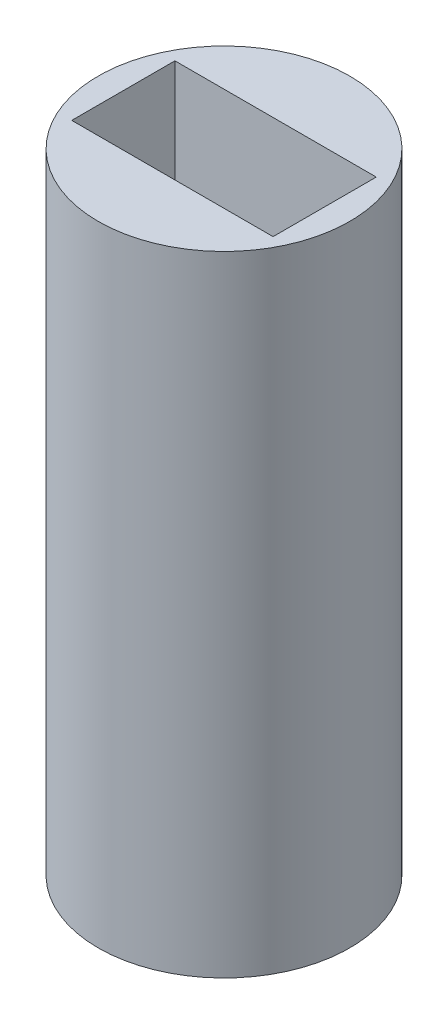
ISO-10303-21;
HEADER;
FILE_DESCRIPTION(('STEP AP214'),'2;1');
FILE_NAME('part.step','',(''),(''),'','','');
FILE_SCHEMA(('AUTOMOTIVE_DESIGN { 1 0 10303 214 1 1 1 1 }'));
ENDSEC;
DATA;
#1=APPLICATION_CONTEXT('core data for automotive mechanical design processes');
#2=APPLICATION_PROTOCOL_DEFINITION('international standard','automotive_design',2000,#1);
#3=PRODUCT_CONTEXT('',#1,'mechanical');
#4=PRODUCT('Part','Part','',(#3));
#5=PRODUCT_RELATED_PRODUCT_CATEGORY('part','',(#4));
#6=PRODUCT_DEFINITION_FORMATION('','',#4);
#7=PRODUCT_DEFINITION_CONTEXT('part definition',#1,'design');
#8=PRODUCT_DEFINITION('design','',#6,#7);
#9=PRODUCT_DEFINITION_SHAPE('','',#8);
#10=(LENGTH_UNIT() NAMED_UNIT(*) SI_UNIT(.MILLI.,.METRE.));
#11=(NAMED_UNIT(*) PLANE_ANGLE_UNIT() SI_UNIT($,.RADIAN.));
#12=(NAMED_UNIT(*) SI_UNIT($,.STERADIAN.) SOLID_ANGLE_UNIT());
#13=UNCERTAINTY_MEASURE_WITH_UNIT(LENGTH_MEASURE(1.E-05),#10,'distance_accuracy_value','');
#14=(GEOMETRIC_REPRESENTATION_CONTEXT(3) GLOBAL_UNCERTAINTY_ASSIGNED_CONTEXT((#13)) GLOBAL_UNIT_ASSIGNED_CONTEXT((#10,
#11,#12)) REPRESENTATION_CONTEXT('',''));
#15=CARTESIAN_POINT('',(0.,0.,0.));
#16=DIRECTION('',(0.,0.,1.));
#17=DIRECTION('',(1.,0.,0.));
#18=AXIS2_PLACEMENT_3D('',#15,#16,#17);
#19=CARTESIAN_POINT('',(0.,25.,0.));
#20=DIRECTION('',(0.,1.,0.));
#21=DIRECTION('',(0.,0.,1.));
#22=AXIS2_PLACEMENT_3D('',#19,#20,#21);
#23=PLANE('',#22);
#24=CARTESIAN_POINT('',(0.,25.,0.));
#25=DIRECTION('',(0.,1.,0.));
#26=DIRECTION('',(0.,0.,1.));
#27=AXIS2_PLACEMENT_3D('',#24,#25,#26);
#28=CIRCLE('',#27,5.);
#29=CARTESIAN_POINT('',(0.,25.,5.));
#30=VERTEX_POINT('',#29);
#31=EDGE_CURVE('E11',#30,#30,#28,.T.);
#32=ORIENTED_EDGE('',*,*,#31,.T.);
#33=EDGE_LOOP('',(#32));
#34=FACE_BOUND('',#33,.T.);
#35=DIRECTION('',(0.,0.,1.));
#36=VECTOR('',#35,1.);
#37=CARTESIAN_POINT('',(-4.,25.,-2.05));
#38=LINE('',#37,#36);
#39=CARTESIAN_POINT('',(-4.,25.,-2.05));
#40=VERTEX_POINT('',#39);
#41=CARTESIAN_POINT('',(-4.,25.,2.05));
#42=VERTEX_POINT('',#41);
#43=EDGE_CURVE('E89',#40,#42,#38,.T.);
#44=ORIENTED_EDGE('',*,*,#43,.F.);
#45=DIRECTION('',(-1.,0.,0.));
#46=VECTOR('',#45,1.);
#47=CARTESIAN_POINT('',(-4.,25.,-2.05));
#48=LINE('',#47,#46);
#49=CARTESIAN_POINT('',(4.,25.,-2.05));
#50=VERTEX_POINT('',#49);
#51=EDGE_CURVE('E94',#50,#40,#48,.T.);
#52=ORIENTED_EDGE('',*,*,#51,.F.);
#53=DIRECTION('',(0.,0.,1.));
#54=VECTOR('',#53,1.);
#55=CARTESIAN_POINT('',(4.,25.,-2.05));
#56=LINE('',#55,#54);
#57=CARTESIAN_POINT('',(4.,25.,2.05));
#58=VERTEX_POINT('',#57);
#59=EDGE_CURVE('E79',#50,#58,#56,.T.);
#60=ORIENTED_EDGE('',*,*,#59,.T.);
#61=DIRECTION('',(-1.,0.,0.));
#62=VECTOR('',#61,1.);
#63=CARTESIAN_POINT('',(-4.,25.,2.05));
#64=LINE('',#63,#62);
#65=EDGE_CURVE('E106',#58,#42,#64,.T.);
#66=ORIENTED_EDGE('',*,*,#65,.T.);
#67=EDGE_LOOP('',(#44,#52,#60,#66));
#68=FACE_BOUND('',#67,.T.);
#69=ADVANCED_FACE('F33',(#34,#68),#23,.T.);
#70=CARTESIAN_POINT('',(0.,25.,0.));
#71=DIRECTION('',(0.,-1.,0.));
#72=DIRECTION('',(0.,0.,-1.));
#73=AXIS2_PLACEMENT_3D('',#70,#71,#72);
#74=CYLINDRICAL_SURFACE('',#73,5.);
#75=ORIENTED_EDGE('',*,*,#31,.F.);
#76=EDGE_LOOP('',(#75));
#77=FACE_BOUND('',#76,.T.);
#78=CARTESIAN_POINT('',(0.,0.,0.));
#79=DIRECTION('',(0.,1.,0.));
#80=DIRECTION('',(0.,0.,1.));
#81=AXIS2_PLACEMENT_3D('',#78,#79,#80);
#82=CIRCLE('',#81,5.);
#83=CARTESIAN_POINT('',(0.,0.,5.));
#84=VERTEX_POINT('',#83);
#85=EDGE_CURVE('E37',#84,#84,#82,.T.);
#86=ORIENTED_EDGE('',*,*,#85,.T.);
#87=EDGE_LOOP('',(#86));
#88=FACE_BOUND('',#87,.T.);
#89=ADVANCED_FACE('F35',(#77,#88),#74,.T.);
#90=CARTESIAN_POINT('',(0.,0.,0.));
#91=DIRECTION('',(0.,1.,0.));
#92=DIRECTION('',(0.,0.,1.));
#93=AXIS2_PLACEMENT_3D('',#90,#91,#92);
#94=PLANE('',#93);
#95=ORIENTED_EDGE('',*,*,#85,.F.);
#96=EDGE_LOOP('',(#95));
#97=FACE_BOUND('',#96,.T.);
#98=ADVANCED_FACE('F115',(#97),#94,.F.);
#99=CARTESIAN_POINT('',(0.,11.5,-2.05));
#100=DIRECTION('',(0.,0.,1.));
#101=DIRECTION('',(1.,0.,0.));
#102=AXIS2_PLACEMENT_3D('',#99,#100,#101);
#103=CYLINDRICAL_SURFACE('',#102,4.);
#104=CARTESIAN_POINT('',(0.,11.5,2.05));
#105=DIRECTION('',(0.,0.,1.));
#106=DIRECTION('',(1.,0.,0.));
#107=AXIS2_PLACEMENT_3D('',#104,#105,#106);
#108=CIRCLE('',#107,4.);
#109=CARTESIAN_POINT('',(-4.,11.5,2.05));
#110=VERTEX_POINT('',#109);
#111=CARTESIAN_POINT('',(4.,11.5,2.05));
#112=VERTEX_POINT('',#111);
#113=EDGE_CURVE('E103',#110,#112,#108,.T.);
#114=ORIENTED_EDGE('',*,*,#113,.T.);
#115=DIRECTION('',(0.,0.,1.));
#116=VECTOR('',#115,1.);
#117=CARTESIAN_POINT('',(4.,11.5,-2.05));
#118=LINE('',#117,#116);
#119=CARTESIAN_POINT('',(4.,11.5,-2.05));
#120=VERTEX_POINT('',#119);
#121=EDGE_CURVE('E73',#120,#112,#118,.T.);
#122=ORIENTED_EDGE('',*,*,#121,.F.);
#123=CARTESIAN_POINT('',(0.,11.5,-2.05));
#124=DIRECTION('',(0.,0.,1.));
#125=DIRECTION('',(1.,0.,0.));
#126=AXIS2_PLACEMENT_3D('',#123,#124,#125);
#127=CIRCLE('',#126,4.);
#128=CARTESIAN_POINT('',(-4.,11.5,-2.05));
#129=VERTEX_POINT('',#128);
#130=EDGE_CURVE('E95',#129,#120,#127,.T.);
#131=ORIENTED_EDGE('',*,*,#130,.F.);
#132=DIRECTION('',(0.,0.,1.));
#133=VECTOR('',#132,1.);
#134=CARTESIAN_POINT('',(-4.,11.5,-2.05));
#135=LINE('',#134,#133);
#136=EDGE_CURVE('E56',#129,#110,#135,.T.);
#137=ORIENTED_EDGE('',*,*,#136,.T.);
#138=EDGE_LOOP('',(#114,#122,#131,#137));
#139=FACE_BOUND('',#138,.T.);
#140=ADVANCED_FACE('F112',(#139),#103,.F.);
#141=CARTESIAN_POINT('',(-4.,11.5,-2.05));
#142=DIRECTION('',(-1.,0.,0.));
#143=DIRECTION('',(0.,0.,1.));
#144=AXIS2_PLACEMENT_3D('',#141,#142,#143);
#145=PLANE('',#144);
#146=DIRECTION('',(0.,-1.,0.));
#147=VECTOR('',#146,1.);
#148=CARTESIAN_POINT('',(-4.,11.5,2.05));
#149=LINE('',#148,#147);
#150=EDGE_CURVE('E48',#42,#110,#149,.T.);
#151=ORIENTED_EDGE('',*,*,#150,.T.);
#152=ORIENTED_EDGE('',*,*,#136,.F.);
#153=DIRECTION('',(0.,-1.,0.));
#154=VECTOR('',#153,1.);
#155=CARTESIAN_POINT('',(-4.,11.5,-2.05));
#156=LINE('',#155,#154);
#157=EDGE_CURVE('E98',#40,#129,#156,.T.);
#158=ORIENTED_EDGE('',*,*,#157,.F.);
#159=ORIENTED_EDGE('',*,*,#43,.T.);
#160=EDGE_LOOP('',(#151,#152,#158,#159));
#161=FACE_BOUND('',#160,.T.);
#162=ADVANCED_FACE('F114',(#161),#145,.F.);
#163=CARTESIAN_POINT('',(4.,11.5,-2.05));
#164=DIRECTION('',(1.,0.,0.));
#165=DIRECTION('',(0.,0.,-1.));
#166=AXIS2_PLACEMENT_3D('',#163,#164,#165);
#167=PLANE('',#166);
#168=DIRECTION('',(0.,1.,0.));
#169=VECTOR('',#168,1.);
#170=CARTESIAN_POINT('',(4.,11.5,2.05));
#171=LINE('',#170,#169);
#172=EDGE_CURVE('E85',#112,#58,#171,.T.);
#173=ORIENTED_EDGE('',*,*,#172,.T.);
#174=ORIENTED_EDGE('',*,*,#59,.F.);
#175=DIRECTION('',(0.,1.,0.));
#176=VECTOR('',#175,1.);
#177=CARTESIAN_POINT('',(4.,11.5,-2.05));
#178=LINE('',#177,#176);
#179=EDGE_CURVE('E82',#120,#50,#178,.T.);
#180=ORIENTED_EDGE('',*,*,#179,.F.);
#181=ORIENTED_EDGE('',*,*,#121,.T.);
#182=EDGE_LOOP('',(#173,#174,#180,#181));
#183=FACE_BOUND('',#182,.T.);
#184=ADVANCED_FACE('F81',(#183),#167,.F.);
#185=CARTESIAN_POINT('',(0.,11.5,-2.05));
#186=DIRECTION('',(0.,0.,1.));
#187=DIRECTION('',(1.,0.,0.));
#188=AXIS2_PLACEMENT_3D('',#185,#186,#187);
#189=PLANE('',#188);
#190=ORIENTED_EDGE('',*,*,#130,.T.);
#191=ORIENTED_EDGE('',*,*,#179,.T.);
#192=ORIENTED_EDGE('',*,*,#51,.T.);
#193=ORIENTED_EDGE('',*,*,#157,.T.);
#194=EDGE_LOOP('',(#190,#191,#192,#193));
#195=FACE_BOUND('',#194,.T.);
#196=ADVANCED_FACE('F92',(#195),#189,.T.);
#197=CARTESIAN_POINT('',(0.,11.5,2.05));
#198=DIRECTION('',(0.,0.,1.));
#199=DIRECTION('',(1.,0.,0.));
#200=AXIS2_PLACEMENT_3D('',#197,#198,#199);
#201=PLANE('',#200);
#202=ORIENTED_EDGE('',*,*,#113,.F.);
#203=ORIENTED_EDGE('',*,*,#150,.F.);
#204=ORIENTED_EDGE('',*,*,#65,.F.);
#205=ORIENTED_EDGE('',*,*,#172,.F.);
#206=EDGE_LOOP('',(#202,#203,#204,#205));
#207=FACE_BOUND('',#206,.T.);
#208=ADVANCED_FACE('F111',(#207),#201,.F.);
#209=CLOSED_SHELL('',(#69,#89,#98,#140,#162,#184,#196,#208));
#210=MANIFOLD_SOLID_BREP('B2',#209);
#211=ADVANCED_BREP_SHAPE_REPRESENTATION('',(#18,#210),#14);
#212=SHAPE_DEFINITION_REPRESENTATION(#9,#211);
ENDSEC;
END-ISO-10303-21;
